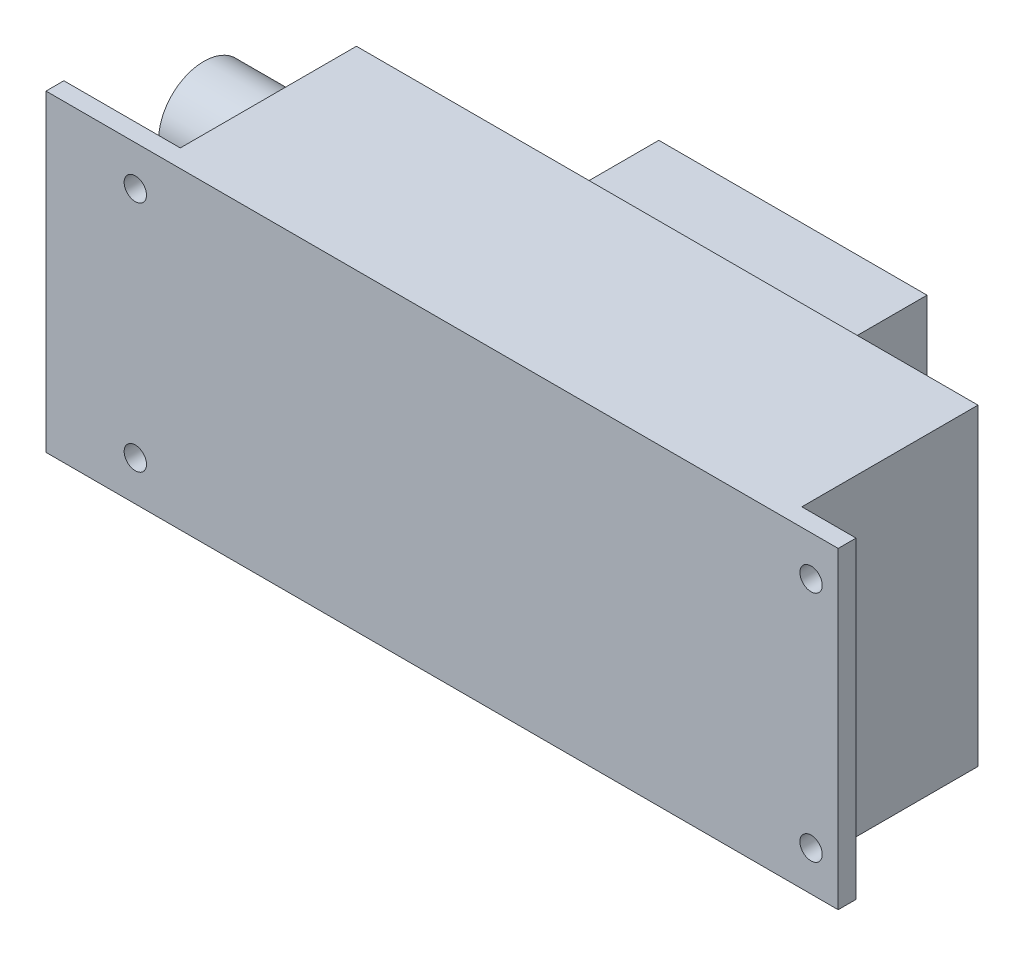
ISO-10303-21;
HEADER;
FILE_DESCRIPTION(('STEP AP214'),'2;1');
FILE_NAME('part.step','',(''),(''),'','','');
FILE_SCHEMA(('AUTOMOTIVE_DESIGN { 1 0 10303 214 1 1 1 1 }'));
ENDSEC;
DATA;
#1=APPLICATION_CONTEXT('core data for automotive mechanical design processes');
#2=APPLICATION_PROTOCOL_DEFINITION('international standard','automotive_design',2000,#1);
#3=PRODUCT_CONTEXT('',#1,'mechanical');
#4=PRODUCT('Part','Part','',(#3));
#5=PRODUCT_RELATED_PRODUCT_CATEGORY('part','',(#4));
#6=PRODUCT_DEFINITION_FORMATION('','',#4);
#7=PRODUCT_DEFINITION_CONTEXT('part definition',#1,'design');
#8=PRODUCT_DEFINITION('design','',#6,#7);
#9=PRODUCT_DEFINITION_SHAPE('','',#8);
#10=(LENGTH_UNIT() NAMED_UNIT(*) SI_UNIT(.MILLI.,.METRE.));
#11=(NAMED_UNIT(*) PLANE_ANGLE_UNIT() SI_UNIT($,.RADIAN.));
#12=(NAMED_UNIT(*) SI_UNIT($,.STERADIAN.) SOLID_ANGLE_UNIT());
#13=UNCERTAINTY_MEASURE_WITH_UNIT(LENGTH_MEASURE(1.E-05),#10,'distance_accuracy_value','');
#14=(GEOMETRIC_REPRESENTATION_CONTEXT(3) GLOBAL_UNCERTAINTY_ASSIGNED_CONTEXT((#13)) GLOBAL_UNIT_ASSIGNED_CONTEXT((#10,
#11,#12)) REPRESENTATION_CONTEXT('',''));
#15=CARTESIAN_POINT('',(0.,0.,0.));
#16=DIRECTION('',(0.,0.,1.));
#17=DIRECTION('',(1.,0.,0.));
#18=AXIS2_PLACEMENT_3D('',#15,#16,#17);
#19=CARTESIAN_POINT('',(0.,0.,32.));
#20=DIRECTION('',(0.,1.,0.));
#21=DIRECTION('',(0.,0.,1.));
#22=AXIS2_PLACEMENT_3D('',#19,#20,#21);
#23=PLANE('',#22);
#24=DIRECTION('',(-1.,0.,0.));
#25=VECTOR('',#24,1.);
#26=CARTESIAN_POINT('',(0.,0.,10.3));
#27=LINE('',#26,#25);
#28=CARTESIAN_POINT('',(82.54,0.,10.3));
#29=VERTEX_POINT('',#28);
#30=CARTESIAN_POINT('',(13.02,0.,10.3));
#31=VERTEX_POINT('',#30);
#32=EDGE_CURVE('E261',#29,#31,#27,.T.);
#33=ORIENTED_EDGE('',*,*,#32,.F.);
#34=DIRECTION('',(0.,0.,-1.));
#35=VECTOR('',#34,1.);
#36=CARTESIAN_POINT('',(82.54,0.,30.));
#37=LINE('',#36,#35);
#38=CARTESIAN_POINT('',(82.54,0.,30.));
#39=VERTEX_POINT('',#38);
#40=EDGE_CURVE('E285',#39,#29,#37,.T.);
#41=ORIENTED_EDGE('',*,*,#40,.F.);
#42=DIRECTION('',(-1.,0.,0.));
#43=VECTOR('',#42,1.);
#44=CARTESIAN_POINT('',(88.6,0.,30.));
#45=LINE('',#44,#43);
#46=CARTESIAN_POINT('',(88.6,0.,30.));
#47=VERTEX_POINT('',#46);
#48=EDGE_CURVE('E274',#47,#39,#45,.T.);
#49=ORIENTED_EDGE('',*,*,#48,.F.);
#50=DIRECTION('',(0.,0.,-1.));
#51=VECTOR('',#50,1.);
#52=CARTESIAN_POINT('',(88.6,0.,32.));
#53=LINE('',#52,#51);
#54=CARTESIAN_POINT('',(88.6,0.,32.));
#55=VERTEX_POINT('',#54);
#56=EDGE_CURVE('E360',#55,#47,#53,.T.);
#57=ORIENTED_EDGE('',*,*,#56,.F.);
#58=DIRECTION('',(1.,0.,0.));
#59=VECTOR('',#58,1.);
#60=CARTESIAN_POINT('',(0.,0.,32.));
#61=LINE('',#60,#59);
#62=CARTESIAN_POINT('',(0.,0.,32.));
#63=VERTEX_POINT('',#62);
#64=EDGE_CURVE('E343',#63,#55,#61,.T.);
#65=ORIENTED_EDGE('',*,*,#64,.F.);
#66=DIRECTION('',(0.,0.,-1.));
#67=VECTOR('',#66,1.);
#68=CARTESIAN_POINT('',(0.,0.,32.));
#69=LINE('',#68,#67);
#70=CARTESIAN_POINT('',(0.,0.,30.));
#71=VERTEX_POINT('',#70);
#72=EDGE_CURVE('E55',#63,#71,#69,.T.);
#73=ORIENTED_EDGE('',*,*,#72,.T.);
#74=DIRECTION('',(-1.,0.,0.));
#75=VECTOR('',#74,1.);
#76=CARTESIAN_POINT('',(0.,0.,30.));
#77=LINE('',#76,#75);
#78=CARTESIAN_POINT('',(13.02,0.,30.));
#79=VERTEX_POINT('',#78);
#80=EDGE_CURVE('E298',#79,#71,#77,.T.);
#81=ORIENTED_EDGE('',*,*,#80,.F.);
#82=DIRECTION('',(0.,0.,-1.));
#83=VECTOR('',#82,1.);
#84=CARTESIAN_POINT('',(13.02,0.,30.));
#85=LINE('',#84,#83);
#86=EDGE_CURVE('E269',#79,#31,#85,.T.);
#87=ORIENTED_EDGE('',*,*,#86,.T.);
#88=EDGE_LOOP('',(#33,#41,#49,#57,#65,#73,#81,#87));
#89=FACE_BOUND('',#88,.T.);
#90=ADVANCED_FACE('F46',(#89),#23,.F.);
#91=CARTESIAN_POINT('',(0.,35.,32.));
#92=DIRECTION('',(0.,-1.,0.));
#93=DIRECTION('',(0.,0.,-1.));
#94=AXIS2_PLACEMENT_3D('',#91,#92,#93);
#95=PLANE('',#94);
#96=DIRECTION('',(1.,0.,0.));
#97=VECTOR('',#96,1.);
#98=CARTESIAN_POINT('',(0.,35.,10.3));
#99=LINE('',#98,#97);
#100=CARTESIAN_POINT('',(13.02,35.,10.3));
#101=VERTEX_POINT('',#100);
#102=CARTESIAN_POINT('',(82.54,35.,10.3));
#103=VERTEX_POINT('',#102);
#104=EDGE_CURVE('E250',#101,#103,#99,.T.);
#105=ORIENTED_EDGE('',*,*,#104,.F.);
#106=DIRECTION('',(0.,0.,-1.));
#107=VECTOR('',#106,1.);
#108=CARTESIAN_POINT('',(13.02,35.,30.));
#109=LINE('',#108,#107);
#110=CARTESIAN_POINT('',(13.02,35.,30.));
#111=VERTEX_POINT('',#110);
#112=EDGE_CURVE('E294',#111,#101,#109,.T.);
#113=ORIENTED_EDGE('',*,*,#112,.F.);
#114=DIRECTION('',(1.,0.,0.));
#115=VECTOR('',#114,1.);
#116=CARTESIAN_POINT('',(0.,35.,30.));
#117=LINE('',#116,#115);
#118=CARTESIAN_POINT('',(0.,35.,30.));
#119=VERTEX_POINT('',#118);
#120=EDGE_CURVE('E308',#119,#111,#117,.T.);
#121=ORIENTED_EDGE('',*,*,#120,.F.);
#122=DIRECTION('',(0.,0.,-1.));
#123=VECTOR('',#122,1.);
#124=CARTESIAN_POINT('',(0.,35.,32.));
#125=LINE('',#124,#123);
#126=CARTESIAN_POINT('',(0.,35.,32.));
#127=VERTEX_POINT('',#126);
#128=EDGE_CURVE('E352',#127,#119,#125,.T.);
#129=ORIENTED_EDGE('',*,*,#128,.F.);
#130=DIRECTION('',(-1.,0.,0.));
#131=VECTOR('',#130,1.);
#132=CARTESIAN_POINT('',(0.,35.,32.));
#133=LINE('',#132,#131);
#134=CARTESIAN_POINT('',(88.6,35.,32.));
#135=VERTEX_POINT('',#134);
#136=EDGE_CURVE('E349',#135,#127,#133,.T.);
#137=ORIENTED_EDGE('',*,*,#136,.F.);
#138=DIRECTION('',(0.,0.,-1.));
#139=VECTOR('',#138,1.);
#140=CARTESIAN_POINT('',(88.6,35.,32.));
#141=LINE('',#140,#139);
#142=CARTESIAN_POINT('',(88.6,35.,30.));
#143=VERTEX_POINT('',#142);
#144=EDGE_CURVE('E356',#135,#143,#141,.T.);
#145=ORIENTED_EDGE('',*,*,#144,.T.);
#146=DIRECTION('',(1.,0.,0.));
#147=VECTOR('',#146,1.);
#148=CARTESIAN_POINT('',(88.6,35.,30.));
#149=LINE('',#148,#147);
#150=CARTESIAN_POINT('',(82.54,35.,30.));
#151=VERTEX_POINT('',#150);
#152=EDGE_CURVE('E282',#151,#143,#149,.T.);
#153=ORIENTED_EDGE('',*,*,#152,.F.);
#154=DIRECTION('',(0.,0.,-1.));
#155=VECTOR('',#154,1.);
#156=CARTESIAN_POINT('',(82.54,35.,30.));
#157=LINE('',#156,#155);
#158=EDGE_CURVE('E286',#151,#103,#157,.T.);
#159=ORIENTED_EDGE('',*,*,#158,.T.);
#160=EDGE_LOOP('',(#105,#113,#121,#129,#137,#145,#153,#159));
#161=FACE_BOUND('',#160,.T.);
#162=ADVANCED_FACE('F394',(#161),#95,.F.);
#163=CARTESIAN_POINT('',(13.02,35.,30.));
#164=DIRECTION('',(1.,0.,0.));
#165=DIRECTION('',(0.,1.,0.));
#166=AXIS2_PLACEMENT_3D('',#163,#164,#165);
#167=PLANE('',#166);
#168=CARTESIAN_POINT('',(13.02,10.995,14.35));
#169=DIRECTION('',(-1.,0.,0.));
#170=DIRECTION('',(0.,-1.,0.));
#171=AXIS2_PLACEMENT_3D('',#168,#169,#170);
#172=CIRCLE('',#171,5.05);
#173=CARTESIAN_POINT('',(13.02,7.97837937420034,10.3));
#174=VERTEX_POINT('',#173);
#175=CARTESIAN_POINT('',(13.02,10.995,19.4));
#176=VERTEX_POINT('',#175);
#177=EDGE_CURVE('E190',#174,#176,#172,.T.);
#178=ORIENTED_EDGE('',*,*,#177,.F.);
#179=DIRECTION('',(0.,1.,0.));
#180=VECTOR('',#179,1.);
#181=CARTESIAN_POINT('',(13.02,35.,10.3));
#182=LINE('',#181,#180);
#183=EDGE_CURVE('E265',#31,#174,#182,.T.);
#184=ORIENTED_EDGE('',*,*,#183,.F.);
#185=ORIENTED_EDGE('',*,*,#86,.F.);
#186=DIRECTION('',(0.,-1.,0.));
#187=VECTOR('',#186,1.);
#188=CARTESIAN_POINT('',(13.02,35.,30.));
#189=LINE('',#188,#187);
#190=EDGE_CURVE('E304',#111,#79,#189,.T.);
#191=ORIENTED_EDGE('',*,*,#190,.F.);
#192=ORIENTED_EDGE('',*,*,#112,.T.);
#193=CARTESIAN_POINT('',(13.02,27.0216206257997,10.3));
#194=VERTEX_POINT('',#193);
#195=EDGE_CURVE('E264',#194,#101,#182,.T.);
#196=ORIENTED_EDGE('',*,*,#195,.F.);
#197=CARTESIAN_POINT('',(13.02,24.005,14.35));
#198=DIRECTION('',(-1.,0.,0.));
#199=DIRECTION('',(0.,-1.,0.));
#200=AXIS2_PLACEMENT_3D('',#197,#198,#199);
#201=CIRCLE('',#200,5.05);
#202=CARTESIAN_POINT('',(13.02,24.005,19.4));
#203=VERTEX_POINT('',#202);
#204=EDGE_CURVE('E62',#203,#194,#201,.T.);
#205=ORIENTED_EDGE('',*,*,#204,.F.);
#206=DIRECTION('',(0.,1.,0.));
#207=VECTOR('',#206,1.);
#208=CARTESIAN_POINT('',(13.02,24.005,19.4));
#209=LINE('',#208,#207);
#210=EDGE_CURVE('E198',#176,#203,#209,.T.);
#211=ORIENTED_EDGE('',*,*,#210,.F.);
#212=EDGE_LOOP('',(#178,#184,#185,#191,#192,#196,#205,#211));
#213=FACE_BOUND('',#212,.T.);
#214=ADVANCED_FACE('F400',(#213),#167,.F.);
#215=CARTESIAN_POINT('',(82.54,35.,30.));
#216=DIRECTION('',(-1.,0.,0.));
#217=DIRECTION('',(0.,0.,1.));
#218=AXIS2_PLACEMENT_3D('',#215,#216,#217);
#219=PLANE('',#218);
#220=DIRECTION('',(0.,-1.,0.));
#221=VECTOR('',#220,1.);
#222=CARTESIAN_POINT('',(82.54,35.,10.3));
#223=LINE('',#222,#221);
#224=EDGE_CURVE('E12',#103,#29,#223,.T.);
#225=ORIENTED_EDGE('',*,*,#224,.F.);
#226=ORIENTED_EDGE('',*,*,#158,.F.);
#227=DIRECTION('',(0.,1.,0.));
#228=VECTOR('',#227,1.);
#229=CARTESIAN_POINT('',(82.54,35.,30.));
#230=LINE('',#229,#228);
#231=EDGE_CURVE('E279',#39,#151,#230,.T.);
#232=ORIENTED_EDGE('',*,*,#231,.F.);
#233=ORIENTED_EDGE('',*,*,#40,.T.);
#234=EDGE_LOOP('',(#225,#226,#232,#233));
#235=FACE_BOUND('',#234,.T.);
#236=ADVANCED_FACE('F406',(#235),#219,.F.);
#237=CARTESIAN_POINT('',(88.6,0.,32.));
#238=DIRECTION('',(-1.,0.,0.));
#239=DIRECTION('',(0.,-1.,0.));
#240=AXIS2_PLACEMENT_3D('',#237,#238,#239);
#241=PLANE('',#240);
#242=DIRECTION('',(0.,-1.,0.));
#243=VECTOR('',#242,1.);
#244=CARTESIAN_POINT('',(88.6,35.,30.));
#245=LINE('',#244,#243);
#246=EDGE_CURVE('E271',#143,#47,#245,.T.);
#247=ORIENTED_EDGE('',*,*,#246,.F.);
#248=ORIENTED_EDGE('',*,*,#144,.F.);
#249=DIRECTION('',(0.,1.,0.));
#250=VECTOR('',#249,1.);
#251=CARTESIAN_POINT('',(88.6,0.,32.));
#252=LINE('',#251,#250);
#253=EDGE_CURVE('E346',#55,#135,#252,.T.);
#254=ORIENTED_EDGE('',*,*,#253,.F.);
#255=ORIENTED_EDGE('',*,*,#56,.T.);
#256=EDGE_LOOP('',(#247,#248,#254,#255));
#257=FACE_BOUND('',#256,.T.);
#258=ADVANCED_FACE('F389',(#257),#241,.F.);
#259=CARTESIAN_POINT('',(85.57,30.535,32.));
#260=DIRECTION('',(0.,0.,1.));
#261=DIRECTION('',(1.,0.,0.));
#262=AXIS2_PLACEMENT_3D('',#259,#260,#261);
#263=CYLINDRICAL_SURFACE('',#262,1.24999999999999);
#264=CARTESIAN_POINT('',(85.57,30.535,32.));
#265=DIRECTION('',(0.,0.,1.));
#266=DIRECTION('',(1.,0.,0.));
#267=AXIS2_PLACEMENT_3D('',#264,#265,#266);
#268=CIRCLE('',#267,1.24999999999999);
#269=CARTESIAN_POINT('',(86.82,30.535,32.));
#270=VERTEX_POINT('',#269);
#271=EDGE_CURVE('E335',#270,#270,#268,.T.);
#272=ORIENTED_EDGE('',*,*,#271,.T.);
#273=EDGE_LOOP('',(#272));
#274=FACE_BOUND('',#273,.T.);
#275=CARTESIAN_POINT('',(85.57,30.535,30.));
#276=DIRECTION('',(0.,0.,-1.));
#277=DIRECTION('',(-1.,0.,0.));
#278=AXIS2_PLACEMENT_3D('',#275,#276,#277);
#279=CIRCLE('',#278,1.24999999999999);
#280=CARTESIAN_POINT('',(84.32,30.535,30.));
#281=VERTEX_POINT('',#280);
#282=EDGE_CURVE('E319',#281,#281,#279,.F.);
#283=ORIENTED_EDGE('',*,*,#282,.F.);
#284=EDGE_LOOP('',(#283));
#285=FACE_BOUND('',#284,.T.);
#286=ADVANCED_FACE('F379',(#274,#285),#263,.F.);
#287=CARTESIAN_POINT('',(85.57,4.465,32.));
#288=DIRECTION('',(0.,0.,1.));
#289=DIRECTION('',(1.,0.,0.));
#290=AXIS2_PLACEMENT_3D('',#287,#288,#289);
#291=CYLINDRICAL_SURFACE('',#290,1.24999999999999);
#292=CARTESIAN_POINT('',(85.57,4.465,32.));
#293=DIRECTION('',(0.,0.,1.));
#294=DIRECTION('',(1.,0.,0.));
#295=AXIS2_PLACEMENT_3D('',#292,#293,#294);
#296=CIRCLE('',#295,1.24999999999999);
#297=CARTESIAN_POINT('',(86.82,4.465,32.));
#298=VERTEX_POINT('',#297);
#299=EDGE_CURVE('E331',#298,#298,#296,.T.);
#300=ORIENTED_EDGE('',*,*,#299,.T.);
#301=EDGE_LOOP('',(#300));
#302=FACE_BOUND('',#301,.T.);
#303=CARTESIAN_POINT('',(85.57,4.465,30.));
#304=DIRECTION('',(0.,0.,-1.));
#305=DIRECTION('',(-1.,0.,0.));
#306=AXIS2_PLACEMENT_3D('',#303,#304,#305);
#307=CIRCLE('',#306,1.24999999999999);
#308=CARTESIAN_POINT('',(84.32,4.465,30.));
#309=VERTEX_POINT('',#308);
#310=EDGE_CURVE('E318',#309,#309,#307,.F.);
#311=ORIENTED_EDGE('',*,*,#310,.F.);
#312=EDGE_LOOP('',(#311));
#313=FACE_BOUND('',#312,.T.);
#314=ADVANCED_FACE('F376',(#302,#313),#291,.F.);
#315=CARTESIAN_POINT('',(0.,0.,32.));
#316=DIRECTION('',(0.,0.,-1.));
#317=DIRECTION('',(-1.,0.,0.));
#318=AXIS2_PLACEMENT_3D('',#315,#316,#317);
#319=PLANE('',#318);
#320=CARTESIAN_POINT('',(9.98999999999998,30.535,32.));
#321=DIRECTION('',(0.,0.,1.));
#322=DIRECTION('',(1.,0.,0.));
#323=AXIS2_PLACEMENT_3D('',#320,#321,#322);
#324=CIRCLE('',#323,1.24999999999999);
#325=CARTESIAN_POINT('',(11.24,30.535,32.));
#326=VERTEX_POINT('',#325);
#327=EDGE_CURVE('E323',#326,#326,#324,.T.);
#328=ORIENTED_EDGE('',*,*,#327,.F.);
#329=EDGE_LOOP('',(#328));
#330=FACE_BOUND('',#329,.T.);
#331=ORIENTED_EDGE('',*,*,#299,.F.);
#332=EDGE_LOOP('',(#331));
#333=FACE_BOUND('',#332,.T.);
#334=ORIENTED_EDGE('',*,*,#271,.F.);
#335=EDGE_LOOP('',(#334));
#336=FACE_BOUND('',#335,.T.);
#337=DIRECTION('',(0.,-1.,0.));
#338=VECTOR('',#337,1.);
#339=CARTESIAN_POINT('',(0.,0.,32.));
#340=LINE('',#339,#338);
#341=EDGE_CURVE('E339',#127,#63,#340,.T.);
#342=ORIENTED_EDGE('',*,*,#341,.T.);
#343=ORIENTED_EDGE('',*,*,#64,.T.);
#344=ORIENTED_EDGE('',*,*,#253,.T.);
#345=ORIENTED_EDGE('',*,*,#136,.T.);
#346=EDGE_LOOP('',(#342,#343,#344,#345));
#347=FACE_BOUND('',#346,.T.);
#348=CARTESIAN_POINT('',(9.98999999999998,4.465,32.));
#349=DIRECTION('',(0.,0.,1.));
#350=DIRECTION('',(1.,0.,0.));
#351=AXIS2_PLACEMENT_3D('',#348,#349,#350);
#352=CIRCLE('',#351,1.24999999999999);
#353=CARTESIAN_POINT('',(11.24,4.465,32.));
#354=VERTEX_POINT('',#353);
#355=EDGE_CURVE('E327',#354,#354,#352,.T.);
#356=ORIENTED_EDGE('',*,*,#355,.F.);
#357=EDGE_LOOP('',(#356));
#358=FACE_BOUND('',#357,.T.);
#359=ADVANCED_FACE('F378',(#330,#333,#336,#347,#358),#319,.F.);
#360=CARTESIAN_POINT('',(0.,0.,32.));
#361=DIRECTION('',(1.,0.,0.));
#362=DIRECTION('',(0.,1.,0.));
#363=AXIS2_PLACEMENT_3D('',#360,#361,#362);
#364=PLANE('',#363);
#365=ORIENTED_EDGE('',*,*,#128,.T.);
#366=DIRECTION('',(0.,1.,0.));
#367=VECTOR('',#366,1.);
#368=CARTESIAN_POINT('',(0.,35.,30.));
#369=LINE('',#368,#367);
#370=EDGE_CURVE('E275',#71,#119,#369,.T.);
#371=ORIENTED_EDGE('',*,*,#370,.F.);
#372=ORIENTED_EDGE('',*,*,#72,.F.);
#373=ORIENTED_EDGE('',*,*,#341,.F.);
#374=EDGE_LOOP('',(#365,#371,#372,#373));
#375=FACE_BOUND('',#374,.T.);
#376=ADVANCED_FACE('F48',(#375),#364,.F.);
#377=CARTESIAN_POINT('',(9.98999999999998,4.465,32.));
#378=DIRECTION('',(0.,0.,1.));
#379=DIRECTION('',(1.,0.,0.));
#380=AXIS2_PLACEMENT_3D('',#377,#378,#379);
#381=CYLINDRICAL_SURFACE('',#380,1.24999999999999);
#382=CARTESIAN_POINT('',(9.98999999999998,4.465,30.));
#383=DIRECTION('',(0.,0.,1.));
#384=DIRECTION('',(1.,0.,0.));
#385=AXIS2_PLACEMENT_3D('',#382,#383,#384);
#386=CIRCLE('',#385,1.24999999999999);
#387=CARTESIAN_POINT('',(11.24,4.465,30.));
#388=VERTEX_POINT('',#387);
#389=EDGE_CURVE('E314',#388,#388,#386,.F.);
#390=ORIENTED_EDGE('',*,*,#389,.T.);
#391=EDGE_LOOP('',(#390));
#392=FACE_BOUND('',#391,.T.);
#393=ORIENTED_EDGE('',*,*,#355,.T.);
#394=EDGE_LOOP('',(#393));
#395=FACE_BOUND('',#394,.T.);
#396=ADVANCED_FACE('F501',(#392,#395),#381,.F.);
#397=CARTESIAN_POINT('',(9.98999999999998,30.535,32.));
#398=DIRECTION('',(0.,0.,1.));
#399=DIRECTION('',(1.,0.,0.));
#400=AXIS2_PLACEMENT_3D('',#397,#398,#399);
#401=CYLINDRICAL_SURFACE('',#400,1.24999999999999);
#402=CARTESIAN_POINT('',(9.98999999999998,30.535,30.));
#403=DIRECTION('',(0.,0.,1.));
#404=DIRECTION('',(1.,0.,0.));
#405=AXIS2_PLACEMENT_3D('',#402,#403,#404);
#406=CIRCLE('',#405,1.24999999999999);
#407=CARTESIAN_POINT('',(11.24,30.535,30.));
#408=VERTEX_POINT('',#407);
#409=EDGE_CURVE('E290',#408,#408,#406,.F.);
#410=ORIENTED_EDGE('',*,*,#409,.T.);
#411=EDGE_LOOP('',(#410));
#412=FACE_BOUND('',#411,.T.);
#413=ORIENTED_EDGE('',*,*,#327,.T.);
#414=EDGE_LOOP('',(#413));
#415=FACE_BOUND('',#414,.T.);
#416=ADVANCED_FACE('F498',(#412,#415),#401,.F.);
#417=CARTESIAN_POINT('',(0.,0.,30.));
#418=DIRECTION('',(0.,0.,1.));
#419=DIRECTION('',(1.,0.,0.));
#420=AXIS2_PLACEMENT_3D('',#417,#418,#419);
#421=PLANE('',#420);
#422=ORIENTED_EDGE('',*,*,#409,.F.);
#423=EDGE_LOOP('',(#422));
#424=FACE_BOUND('',#423,.T.);
#425=ORIENTED_EDGE('',*,*,#370,.T.);
#426=ORIENTED_EDGE('',*,*,#120,.T.);
#427=ORIENTED_EDGE('',*,*,#190,.T.);
#428=ORIENTED_EDGE('',*,*,#80,.T.);
#429=EDGE_LOOP('',(#425,#426,#427,#428));
#430=FACE_BOUND('',#429,.T.);
#431=ORIENTED_EDGE('',*,*,#389,.F.);
#432=EDGE_LOOP('',(#431));
#433=FACE_BOUND('',#432,.T.);
#434=ADVANCED_FACE('F448',(#424,#430,#433),#421,.F.);
#435=CARTESIAN_POINT('',(0.,0.,30.));
#436=DIRECTION('',(0.,0.,-1.));
#437=DIRECTION('',(-1.,0.,0.));
#438=AXIS2_PLACEMENT_3D('',#435,#436,#437);
#439=PLANE('',#438);
#440=ORIENTED_EDGE('',*,*,#246,.T.);
#441=ORIENTED_EDGE('',*,*,#48,.T.);
#442=ORIENTED_EDGE('',*,*,#231,.T.);
#443=ORIENTED_EDGE('',*,*,#152,.T.);
#444=EDGE_LOOP('',(#440,#441,#442,#443));
#445=FACE_BOUND('',#444,.T.);
#446=ORIENTED_EDGE('',*,*,#310,.T.);
#447=EDGE_LOOP('',(#446));
#448=FACE_BOUND('',#447,.T.);
#449=ORIENTED_EDGE('',*,*,#282,.T.);
#450=EDGE_LOOP('',(#449));
#451=FACE_BOUND('',#450,.T.);
#452=ADVANCED_FACE('F373',(#445,#448,#451),#439,.T.);
#453=CARTESIAN_POINT('',(44.3,17.5,10.3));
#454=DIRECTION('',(0.,0.,-1.));
#455=DIRECTION('',(-1.,0.,0.));
#456=AXIS2_PLACEMENT_3D('',#453,#454,#455);
#457=PLANE('',#456);
#458=DIRECTION('',(1.,0.,0.));
#459=VECTOR('',#458,1.);
#460=CARTESIAN_POINT('',(66.54,32.5,10.3));
#461=LINE('',#460,#459);
#462=CARTESIAN_POINT('',(36.54,32.5,10.3));
#463=VERTEX_POINT('',#462);
#464=CARTESIAN_POINT('',(66.54,32.5,10.3));
#465=VERTEX_POINT('',#464);
#466=EDGE_CURVE('E228',#463,#465,#461,.T.);
#467=ORIENTED_EDGE('',*,*,#466,.F.);
#468=DIRECTION('',(0.,1.,0.));
#469=VECTOR('',#468,1.);
#470=CARTESIAN_POINT('',(36.54,32.5,10.3));
#471=LINE('',#470,#469);
#472=CARTESIAN_POINT('',(36.54,2.5,10.3));
#473=VERTEX_POINT('',#472);
#474=EDGE_CURVE('E224',#473,#463,#471,.T.);
#475=ORIENTED_EDGE('',*,*,#474,.F.);
#476=DIRECTION('',(-1.,0.,0.));
#477=VECTOR('',#476,1.);
#478=CARTESIAN_POINT('',(66.54,2.5,10.3));
#479=LINE('',#478,#477);
#480=CARTESIAN_POINT('',(66.54,2.5,10.3));
#481=VERTEX_POINT('',#480);
#482=EDGE_CURVE('E219',#481,#473,#479,.T.);
#483=ORIENTED_EDGE('',*,*,#482,.F.);
#484=DIRECTION('',(0.,-1.,0.));
#485=VECTOR('',#484,1.);
#486=CARTESIAN_POINT('',(66.54,32.5,10.3));
#487=LINE('',#486,#485);
#488=EDGE_CURVE('E215',#465,#481,#487,.T.);
#489=ORIENTED_EDGE('',*,*,#488,.F.);
#490=EDGE_LOOP('',(#467,#475,#483,#489));
#491=FACE_BOUND('',#490,.T.);
#492=ORIENTED_EDGE('',*,*,#183,.T.);
#493=EDGE_CURVE('E270',#174,#194,#182,.T.);
#494=ORIENTED_EDGE('',*,*,#493,.T.);
#495=ORIENTED_EDGE('',*,*,#195,.T.);
#496=ORIENTED_EDGE('',*,*,#104,.T.);
#497=ORIENTED_EDGE('',*,*,#224,.T.);
#498=ORIENTED_EDGE('',*,*,#32,.T.);
#499=EDGE_LOOP('',(#492,#494,#495,#496,#497,#498));
#500=FACE_BOUND('',#499,.T.);
#501=ADVANCED_FACE('F434',(#491,#500),#457,.T.);
#502=CARTESIAN_POINT('',(66.54,32.5,10.3));
#503=DIRECTION('',(1.,0.,0.));
#504=DIRECTION('',(0.,1.,0.));
#505=AXIS2_PLACEMENT_3D('',#502,#503,#504);
#506=PLANE('',#505);
#507=DIRECTION('',(0.,-1.,0.));
#508=VECTOR('',#507,1.);
#509=CARTESIAN_POINT('',(66.54,32.5,0.));
#510=LINE('',#509,#508);
#511=CARTESIAN_POINT('',(66.54,32.5,0.));
#512=VERTEX_POINT('',#511);
#513=CARTESIAN_POINT('',(66.54,2.5,0.));
#514=VERTEX_POINT('',#513);
#515=EDGE_CURVE('E233',#512,#514,#510,.T.);
#516=ORIENTED_EDGE('',*,*,#515,.F.);
#517=DIRECTION('',(0.,0.,-1.));
#518=VECTOR('',#517,1.);
#519=CARTESIAN_POINT('',(66.54,32.5,10.3));
#520=LINE('',#519,#518);
#521=EDGE_CURVE('E247',#465,#512,#520,.T.);
#522=ORIENTED_EDGE('',*,*,#521,.F.);
#523=ORIENTED_EDGE('',*,*,#488,.T.);
#524=DIRECTION('',(0.,0.,-1.));
#525=VECTOR('',#524,1.);
#526=CARTESIAN_POINT('',(66.54,2.5,10.3));
#527=LINE('',#526,#525);
#528=EDGE_CURVE('E232',#481,#514,#527,.T.);
#529=ORIENTED_EDGE('',*,*,#528,.T.);
#530=EDGE_LOOP('',(#516,#522,#523,#529));
#531=FACE_BOUND('',#530,.T.);
#532=ADVANCED_FACE('F430',(#531),#506,.T.);
#533=CARTESIAN_POINT('',(66.54,32.5,10.3));
#534=DIRECTION('',(0.,1.,0.));
#535=DIRECTION('',(0.,0.,1.));
#536=AXIS2_PLACEMENT_3D('',#533,#534,#535);
#537=PLANE('',#536);
#538=DIRECTION('',(1.,0.,0.));
#539=VECTOR('',#538,1.);
#540=CARTESIAN_POINT('',(66.54,32.5,0.));
#541=LINE('',#540,#539);
#542=CARTESIAN_POINT('',(36.54,32.5,0.));
#543=VERTEX_POINT('',#542);
#544=EDGE_CURVE('E220',#543,#512,#541,.T.);
#545=ORIENTED_EDGE('',*,*,#544,.F.);
#546=DIRECTION('',(0.,0.,-1.));
#547=VECTOR('',#546,1.);
#548=CARTESIAN_POINT('',(36.54,32.5,10.3));
#549=LINE('',#548,#547);
#550=EDGE_CURVE('E251',#463,#543,#549,.T.);
#551=ORIENTED_EDGE('',*,*,#550,.F.);
#552=ORIENTED_EDGE('',*,*,#466,.T.);
#553=ORIENTED_EDGE('',*,*,#521,.T.);
#554=EDGE_LOOP('',(#545,#551,#552,#553));
#555=FACE_BOUND('',#554,.T.);
#556=ADVANCED_FACE('F426',(#555),#537,.T.);
#557=CARTESIAN_POINT('',(36.54,32.5,10.3));
#558=DIRECTION('',(-1.,0.,0.));
#559=DIRECTION('',(0.,0.,1.));
#560=AXIS2_PLACEMENT_3D('',#557,#558,#559);
#561=PLANE('',#560);
#562=DIRECTION('',(0.,1.,0.));
#563=VECTOR('',#562,1.);
#564=CARTESIAN_POINT('',(36.54,32.5,0.));
#565=LINE('',#564,#563);
#566=CARTESIAN_POINT('',(36.54,2.5,0.));
#567=VERTEX_POINT('',#566);
#568=EDGE_CURVE('E70',#567,#543,#565,.T.);
#569=ORIENTED_EDGE('',*,*,#568,.F.);
#570=DIRECTION('',(0.,0.,-1.));
#571=VECTOR('',#570,1.);
#572=CARTESIAN_POINT('',(36.54,2.5,10.3));
#573=LINE('',#572,#571);
#574=EDGE_CURVE('E254',#473,#567,#573,.T.);
#575=ORIENTED_EDGE('',*,*,#574,.F.);
#576=ORIENTED_EDGE('',*,*,#474,.T.);
#577=ORIENTED_EDGE('',*,*,#550,.T.);
#578=EDGE_LOOP('',(#569,#575,#576,#577));
#579=FACE_BOUND('',#578,.T.);
#580=ADVANCED_FACE('F420',(#579),#561,.T.);
#581=CARTESIAN_POINT('',(66.54,2.5,10.3));
#582=DIRECTION('',(0.,-1.,0.));
#583=DIRECTION('',(0.,0.,-1.));
#584=AXIS2_PLACEMENT_3D('',#581,#582,#583);
#585=PLANE('',#584);
#586=DIRECTION('',(-1.,0.,0.));
#587=VECTOR('',#586,1.);
#588=CARTESIAN_POINT('',(66.54,2.5,0.));
#589=LINE('',#588,#587);
#590=EDGE_CURVE('E237',#514,#567,#589,.T.);
#591=ORIENTED_EDGE('',*,*,#590,.F.);
#592=ORIENTED_EDGE('',*,*,#528,.F.);
#593=ORIENTED_EDGE('',*,*,#482,.T.);
#594=ORIENTED_EDGE('',*,*,#574,.T.);
#595=EDGE_LOOP('',(#591,#592,#593,#594));
#596=FACE_BOUND('',#595,.T.);
#597=ADVANCED_FACE('F411',(#596),#585,.T.);
#598=CARTESIAN_POINT('',(0.,0.,0.));
#599=DIRECTION('',(0.,0.,-1.));
#600=DIRECTION('',(-1.,0.,0.));
#601=AXIS2_PLACEMENT_3D('',#598,#599,#600);
#602=PLANE('',#601);
#603=ORIENTED_EDGE('',*,*,#544,.T.);
#604=ORIENTED_EDGE('',*,*,#515,.T.);
#605=ORIENTED_EDGE('',*,*,#590,.T.);
#606=ORIENTED_EDGE('',*,*,#568,.T.);
#607=EDGE_LOOP('',(#603,#604,#605,#606));
#608=FACE_BOUND('',#607,.T.);
#609=ADVANCED_FACE('F409',(#608),#602,.T.);
#610=CARTESIAN_POINT('',(13.02,24.005,14.35));
#611=DIRECTION('',(-1.,0.,0.));
#612=DIRECTION('',(0.,-1.,0.));
#613=AXIS2_PLACEMENT_3D('',#610,#611,#612);
#614=PLANE('',#613);
#615=ORIENTED_EDGE('',*,*,#493,.F.);
#616=CARTESIAN_POINT('',(13.02,10.995,9.3));
#617=VERTEX_POINT('',#616);
#618=EDGE_CURVE('E188',#617,#174,#172,.T.);
#619=ORIENTED_EDGE('',*,*,#618,.F.);
#620=DIRECTION('',(0.,-1.,0.));
#621=VECTOR('',#620,1.);
#622=CARTESIAN_POINT('',(13.02,24.005,9.3));
#623=LINE('',#622,#621);
#624=CARTESIAN_POINT('',(13.02,24.005,9.3));
#625=VERTEX_POINT('',#624);
#626=EDGE_CURVE('E179',#625,#617,#623,.T.);
#627=ORIENTED_EDGE('',*,*,#626,.F.);
#628=EDGE_CURVE('E164',#194,#625,#201,.T.);
#629=ORIENTED_EDGE('',*,*,#628,.F.);
#630=EDGE_LOOP('',(#615,#619,#627,#629));
#631=FACE_BOUND('',#630,.T.);
#632=ADVANCED_FACE('F186',(#631),#614,.F.);
#633=CARTESIAN_POINT('',(-25.2206681116897,24.005,19.4));
#634=DIRECTION('',(0.,0.,-1.));
#635=DIRECTION('',(-1.,0.,0.));
#636=AXIS2_PLACEMENT_3D('',#633,#634,#635);
#637=PLANE('',#636);
#638=DIRECTION('',(1.,0.,0.));
#639=VECTOR('',#638,1.);
#640=CARTESIAN_POINT('',(-25.2206681116897,24.005,19.4));
#641=LINE('',#640,#639);
#642=CARTESIAN_POINT('',(0.,24.005,19.4));
#643=VERTEX_POINT('',#642);
#644=EDGE_CURVE('E202',#643,#203,#641,.T.);
#645=ORIENTED_EDGE('',*,*,#644,.F.);
#646=DIRECTION('',(0.,-1.,0.));
#647=VECTOR('',#646,1.);
#648=CARTESIAN_POINT('',(0.,24.005,19.4));
#649=LINE('',#648,#647);
#650=CARTESIAN_POINT('',(0.,10.995,19.4));
#651=VERTEX_POINT('',#650);
#652=EDGE_CURVE('E183',#643,#651,#649,.T.);
#653=ORIENTED_EDGE('',*,*,#652,.T.);
#654=DIRECTION('',(1.,0.,0.));
#655=VECTOR('',#654,1.);
#656=CARTESIAN_POINT('',(-25.2206681116897,10.995,19.4));
#657=LINE('',#656,#655);
#658=EDGE_CURVE('E205',#651,#176,#657,.T.);
#659=ORIENTED_EDGE('',*,*,#658,.T.);
#660=ORIENTED_EDGE('',*,*,#210,.T.);
#661=EDGE_LOOP('',(#645,#653,#659,#660));
#662=FACE_BOUND('',#661,.T.);
#663=ADVANCED_FACE('F418',(#662),#637,.F.);
#664=CARTESIAN_POINT('',(-25.2206681116897,10.995,14.35));
#665=DIRECTION('',(1.,0.,0.));
#666=DIRECTION('',(0.,1.,0.));
#667=AXIS2_PLACEMENT_3D('',#664,#665,#666);
#668=CYLINDRICAL_SURFACE('',#667,5.05);
#669=ORIENTED_EDGE('',*,*,#658,.F.);
#670=CARTESIAN_POINT('',(0.,10.995,14.35));
#671=DIRECTION('',(1.,0.,0.));
#672=DIRECTION('',(0.,1.,0.));
#673=AXIS2_PLACEMENT_3D('',#670,#671,#672);
#674=CIRCLE('',#673,5.05);
#675=CARTESIAN_POINT('',(0.,10.995,9.3));
#676=VERTEX_POINT('',#675);
#677=EDGE_CURVE('E214',#651,#676,#674,.T.);
#678=ORIENTED_EDGE('',*,*,#677,.T.);
#679=DIRECTION('',(1.,0.,0.));
#680=VECTOR('',#679,1.);
#681=CARTESIAN_POINT('',(-25.2206681116897,10.995,9.3));
#682=LINE('',#681,#680);
#683=EDGE_CURVE('E184',#676,#617,#682,.T.);
#684=ORIENTED_EDGE('',*,*,#683,.T.);
#685=ORIENTED_EDGE('',*,*,#618,.T.);
#686=ORIENTED_EDGE('',*,*,#177,.T.);
#687=EDGE_LOOP('',(#669,#678,#684,#685,#686));
#688=FACE_BOUND('',#687,.T.);
#689=ADVANCED_FACE('F467',(#688),#668,.T.);
#690=CARTESIAN_POINT('',(-25.2206681116897,24.005,9.3));
#691=DIRECTION('',(0.,0.,1.));
#692=DIRECTION('',(1.,0.,0.));
#693=AXIS2_PLACEMENT_3D('',#690,#691,#692);
#694=PLANE('',#693);
#695=ORIENTED_EDGE('',*,*,#683,.F.);
#696=DIRECTION('',(0.,1.,0.));
#697=VECTOR('',#696,1.);
#698=CARTESIAN_POINT('',(0.,24.005,9.3));
#699=LINE('',#698,#697);
#700=CARTESIAN_POINT('',(0.,24.005,9.3));
#701=VERTEX_POINT('',#700);
#702=EDGE_CURVE('E181',#676,#701,#699,.T.);
#703=ORIENTED_EDGE('',*,*,#702,.T.);
#704=DIRECTION('',(1.,0.,0.));
#705=VECTOR('',#704,1.);
#706=CARTESIAN_POINT('',(-25.2206681116897,24.005,9.3));
#707=LINE('',#706,#705);
#708=EDGE_CURVE('E168',#701,#625,#707,.T.);
#709=ORIENTED_EDGE('',*,*,#708,.T.);
#710=ORIENTED_EDGE('',*,*,#626,.T.);
#711=EDGE_LOOP('',(#695,#703,#709,#710));
#712=FACE_BOUND('',#711,.T.);
#713=ADVANCED_FACE('F178',(#712),#694,.F.);
#714=CARTESIAN_POINT('',(-25.2206681116897,24.005,14.35));
#715=DIRECTION('',(1.,0.,0.));
#716=DIRECTION('',(0.,1.,0.));
#717=AXIS2_PLACEMENT_3D('',#714,#715,#716);
#718=CYLINDRICAL_SURFACE('',#717,5.05);
#719=ORIENTED_EDGE('',*,*,#708,.F.);
#720=CARTESIAN_POINT('',(0.,24.005,14.35));
#721=DIRECTION('',(1.,0.,0.));
#722=DIRECTION('',(0.,1.,0.));
#723=AXIS2_PLACEMENT_3D('',#720,#721,#722);
#724=CIRCLE('',#723,5.05);
#725=EDGE_CURVE('E238',#701,#643,#724,.T.);
#726=ORIENTED_EDGE('',*,*,#725,.T.);
#727=ORIENTED_EDGE('',*,*,#644,.T.);
#728=ORIENTED_EDGE('',*,*,#204,.T.);
#729=ORIENTED_EDGE('',*,*,#628,.T.);
#730=EDGE_LOOP('',(#719,#726,#727,#728,#729));
#731=FACE_BOUND('',#730,.T.);
#732=ADVANCED_FACE('F166',(#731),#718,.T.);
#733=CARTESIAN_POINT('',(0.,0.,32.));
#734=DIRECTION('',(1.,0.,0.));
#735=DIRECTION('',(0.,1.,0.));
#736=AXIS2_PLACEMENT_3D('',#733,#734,#735);
#737=PLANE('',#736);
#738=ORIENTED_EDGE('',*,*,#702,.F.);
#739=ORIENTED_EDGE('',*,*,#677,.F.);
#740=ORIENTED_EDGE('',*,*,#652,.F.);
#741=ORIENTED_EDGE('',*,*,#725,.F.);
#742=EDGE_LOOP('',(#738,#739,#740,#741));
#743=FACE_BOUND('',#742,.T.);
#744=ADVANCED_FACE('F469',(#743),#737,.F.);
#745=CLOSED_SHELL('',(#90,#162,#214,#236,#258,#286,#314,#359,#376,#396,#416,#434,#452,#501,#532,
#556,#580,#597,#609,#632,#663,#689,#713,#732,#744));
#746=MANIFOLD_SOLID_BREP('B2',#745);
#747=ADVANCED_BREP_SHAPE_REPRESENTATION('',(#18,#746),#14);
#748=SHAPE_DEFINITION_REPRESENTATION(#9,#747);
ENDSEC;
END-ISO-10303-21;
